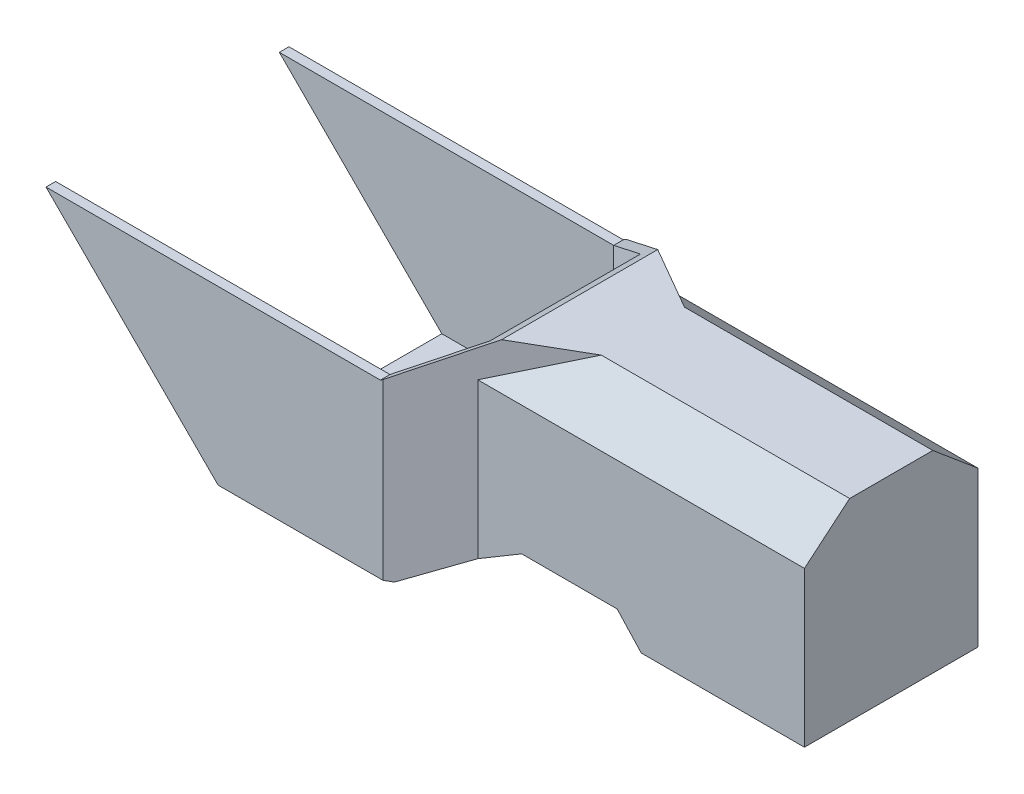
ISO-10303-21;
HEADER;
FILE_DESCRIPTION(('STEP AP214'),'2;1');
FILE_NAME('part.step','',(''),(''),'','','');
FILE_SCHEMA(('AUTOMOTIVE_DESIGN { 1 0 10303 214 1 1 1 1 }'));
ENDSEC;
DATA;
#1=APPLICATION_CONTEXT('core data for automotive mechanical design processes');
#2=APPLICATION_PROTOCOL_DEFINITION('international standard','automotive_design',2000,#1);
#3=PRODUCT_CONTEXT('',#1,'mechanical');
#4=PRODUCT('Part','Part','',(#3));
#5=PRODUCT_RELATED_PRODUCT_CATEGORY('part','',(#4));
#6=PRODUCT_DEFINITION_FORMATION('','',#4);
#7=PRODUCT_DEFINITION_CONTEXT('part definition',#1,'design');
#8=PRODUCT_DEFINITION('design','',#6,#7);
#9=PRODUCT_DEFINITION_SHAPE('','',#8);
#10=(LENGTH_UNIT() NAMED_UNIT(*) SI_UNIT(.MILLI.,.METRE.));
#11=(NAMED_UNIT(*) PLANE_ANGLE_UNIT() SI_UNIT($,.RADIAN.));
#12=(NAMED_UNIT(*) SI_UNIT($,.STERADIAN.) SOLID_ANGLE_UNIT());
#13=UNCERTAINTY_MEASURE_WITH_UNIT(LENGTH_MEASURE(1.E-05),#10,'distance_accuracy_value','');
#14=(GEOMETRIC_REPRESENTATION_CONTEXT(3) GLOBAL_UNCERTAINTY_ASSIGNED_CONTEXT((#13)) GLOBAL_UNIT_ASSIGNED_CONTEXT((#10,
#11,#12)) REPRESENTATION_CONTEXT('',''));
#15=CARTESIAN_POINT('',(0.,0.,0.));
#16=DIRECTION('',(0.,0.,1.));
#17=DIRECTION('',(1.,0.,0.));
#18=AXIS2_PLACEMENT_3D('',#15,#16,#17);
#19=CARTESIAN_POINT('',(823.113265829973,656.076560964654,-1.2E-05));
#20=DIRECTION('',(0.556837554487438,-0.830621416719103,0.));
#21=DIRECTION('',(0.830621416719103,0.556837554487439,0.));
#22=AXIS2_PLACEMENT_3D('',#19,#20,#21);
#23=PLANE('',#22);
#24=DIRECTION('',(-0.748953016614914,-0.502088144855617,-0.432408225753008));
#25=VECTOR('',#24,1.);
#26=CARTESIAN_POINT('',(572.76593130731,488.247036319503,-314.154092808825));
#27=LINE('',#26,#25);
#28=CARTESIAN_POINT('',(779.145427209484,626.601106514855,-195.000835294484));
#29=VERTEX_POINT('',#28);
#30=CARTESIAN_POINT('',(614.602047262927,516.293412236459,-290.));
#31=VERTEX_POINT('',#30);
#32=EDGE_CURVE('E720',#29,#31,#27,.T.);
#33=ORIENTED_EDGE('',*,*,#32,.F.);
#34=DIRECTION('',(0.,0.,-1.));
#35=VECTOR('',#34,1.);
#36=CARTESIAN_POINT('',(779.145427209484,626.601106514855,0.));
#37=LINE('',#36,#35);
#38=CARTESIAN_POINT('',(779.145427209484,626.601106514855,195.000835294484));
#39=VERTEX_POINT('',#38);
#40=EDGE_CURVE('E758',#39,#29,#37,.T.);
#41=ORIENTED_EDGE('',*,*,#40,.F.);
#42=DIRECTION('',(-0.748953016614914,-0.502088144855617,0.432408225753008));
#43=VECTOR('',#42,1.);
#44=CARTESIAN_POINT('',(572.76593130731,488.247036319503,314.154092808825));
#45=LINE('',#44,#43);
#46=CARTESIAN_POINT('',(614.602047262927,516.293412236459,290.));
#47=VERTEX_POINT('',#46);
#48=EDGE_CURVE('E288',#39,#47,#45,.T.);
#49=ORIENTED_EDGE('',*,*,#48,.T.);
#50=DIRECTION('',(0.,0.,1.));
#51=VECTOR('',#50,1.);
#52=CARTESIAN_POINT('',(614.602047262927,516.293412236459,-1.2E-05));
#53=LINE('',#52,#51);
#54=CARTESIAN_POINT('',(614.602047262927,516.293412236459,315.));
#55=VERTEX_POINT('',#54);
#56=EDGE_CURVE('E282',#47,#55,#53,.T.);
#57=ORIENTED_EDGE('',*,*,#56,.T.);
#58=DIRECTION('',(0.830621416719103,0.556837554487439,0.));
#59=VECTOR('',#58,1.);
#60=CARTESIAN_POINT('',(823.113265829973,656.076560964654,315.));
#61=LINE('',#60,#59);
#62=CARTESIAN_POINT('',(621.300777073706,520.784151640628,315.));
#63=VERTEX_POINT('',#62);
#64=EDGE_CURVE('E41',#55,#63,#61,.T.);
#65=ORIENTED_EDGE('',*,*,#64,.T.);
#66=DIRECTION('',(-0.748953016614914,-0.502088144855617,0.432408225753008));
#67=VECTOR('',#66,1.);
#68=CARTESIAN_POINT('',(582.114774992253,494.514376831107,337.624048850192));
#69=LINE('',#68,#67);
#70=CARTESIAN_POINT('',(816.437336224299,651.601106514855,202.337855045667));
#71=VERTEX_POINT('',#70);
#72=EDGE_CURVE('E165',#71,#63,#69,.T.);
#73=ORIENTED_EDGE('',*,*,#72,.F.);
#74=DIRECTION('',(0.,0.,-1.));
#75=VECTOR('',#74,1.);
#76=CARTESIAN_POINT('',(816.437336224299,651.601106514855,0.));
#77=LINE('',#76,#75);
#78=CARTESIAN_POINT('',(816.437336224299,651.601106514855,-202.337855045667));
#79=VERTEX_POINT('',#78);
#80=EDGE_CURVE('E168',#71,#79,#77,.T.);
#81=ORIENTED_EDGE('',*,*,#80,.T.);
#82=DIRECTION('',(-0.748953016614914,-0.502088144855617,-0.432408225753008));
#83=VECTOR('',#82,1.);
#84=CARTESIAN_POINT('',(887.392828925045,699.168725453696,-161.371682234408));
#85=LINE('',#84,#83);
#86=CARTESIAN_POINT('',(621.300777073706,520.784151640628,-315.));
#87=VERTEX_POINT('',#86);
#88=EDGE_CURVE('E57',#79,#87,#85,.T.);
#89=ORIENTED_EDGE('',*,*,#88,.T.);
#90=DIRECTION('',(0.830621416719103,0.556837554487439,0.));
#91=VECTOR('',#90,1.);
#92=CARTESIAN_POINT('',(67.4957418236851,149.520618959844,-315.));
#93=LINE('',#92,#91);
#94=CARTESIAN_POINT('',(614.602047262926,516.293412236459,-315.));
#95=VERTEX_POINT('',#94);
#96=EDGE_CURVE('E11',#95,#87,#93,.T.);
#97=ORIENTED_EDGE('',*,*,#96,.F.);
#98=EDGE_CURVE('E185',#95,#31,#53,.T.);
#99=ORIENTED_EDGE('',*,*,#98,.T.);
#100=EDGE_LOOP('',(#33,#41,#49,#57,#65,#73,#81,#89,#97,#99));
#101=FACE_BOUND('',#100,.T.);
#102=ADVANCED_FACE('F33',(#101),#23,.F.);
#103=CARTESIAN_POINT('',(614.602047262927,516.293412236459,-1.2E-05));
#104=DIRECTION('',(0.,-1.,0.));
#105=DIRECTION('',(1.,0.,0.));
#106=AXIS2_PLACEMENT_3D('',#103,#104,#105);
#107=PLANE('',#106);
#108=DIRECTION('',(1.,0.,0.));
#109=VECTOR('',#108,1.);
#110=CARTESIAN_POINT('',(614.602047262927,516.293412236459,290.));
#111=LINE('',#110,#109);
#112=CARTESIAN_POINT('',(-252.332674150865,516.293412236459,290.));
#113=VERTEX_POINT('',#112);
#114=EDGE_CURVE('E756',#113,#47,#111,.T.);
#115=ORIENTED_EDGE('',*,*,#114,.F.);
#116=DIRECTION('',(0.,0.,1.));
#117=VECTOR('',#116,1.);
#118=CARTESIAN_POINT('',(-252.332674150865,516.293412236459,0.));
#119=LINE('',#118,#117);
#120=CARTESIAN_POINT('',(-252.332674150865,516.293412236459,315.));
#121=VERTEX_POINT('',#120);
#122=EDGE_CURVE('E212',#113,#121,#119,.T.);
#123=ORIENTED_EDGE('',*,*,#122,.T.);
#124=DIRECTION('',(1.,0.,0.));
#125=VECTOR('',#124,1.);
#126=CARTESIAN_POINT('',(614.602047262927,516.293412236459,315.));
#127=LINE('',#126,#125);
#128=EDGE_CURVE('E280',#121,#55,#127,.T.);
#129=ORIENTED_EDGE('',*,*,#128,.T.);
#130=ORIENTED_EDGE('',*,*,#56,.F.);
#131=EDGE_LOOP('',(#115,#123,#129,#130));
#132=FACE_BOUND('',#131,.T.);
#133=ADVANCED_FACE('F372',(#132),#107,.F.);
#134=CARTESIAN_POINT('',(-252.332674150865,70.,0.));
#135=DIRECTION('',(0.,1.,0.));
#136=DIRECTION('',(0.,0.,1.));
#137=AXIS2_PLACEMENT_3D('',#134,#135,#136);
#138=PLANE('',#137);
#139=DIRECTION('',(0.,0.,1.));
#140=VECTOR('',#139,1.);
#141=CARTESIAN_POINT('',(193.960738085595,70.,0.));
#142=LINE('',#141,#140);
#143=CARTESIAN_POINT('',(193.960738085595,70.,-315.));
#144=VERTEX_POINT('',#143);
#145=CARTESIAN_POINT('',(193.960738085595,70.,315.));
#146=VERTEX_POINT('',#145);
#147=EDGE_CURVE('E193',#144,#146,#142,.T.);
#148=ORIENTED_EDGE('',*,*,#147,.F.);
#149=DIRECTION('',(1.,0.,0.));
#150=VECTOR('',#149,1.);
#151=CARTESIAN_POINT('',(-252.332674150865,70.,-315.));
#152=LINE('',#151,#150);
#153=CARTESIAN_POINT('',(621.300777073706,70.,-315.));
#154=VERTEX_POINT('',#153);
#155=EDGE_CURVE('E245',#144,#154,#152,.T.);
#156=ORIENTED_EDGE('',*,*,#155,.T.);
#157=DIRECTION('',(-0.866025403784436,0.,-0.500000000000004));
#158=VECTOR('',#157,1.);
#159=CARTESIAN_POINT('',(782.986619944125,70.,-221.650635094611));
#160=LINE('',#159,#158);
#161=CARTESIAN_POINT('',(640.251617075043,70.,-304.058727423859));
#162=VERTEX_POINT('',#161);
#163=EDGE_CURVE('E255',#162,#154,#160,.T.);
#164=ORIENTED_EDGE('',*,*,#163,.F.);
#165=DIRECTION('',(0.,0.,-1.));
#166=VECTOR('',#165,1.);
#167=CARTESIAN_POINT('',(640.251617075042,70.,2.06251711034448E-13));
#168=LINE('',#167,#166);
#169=CARTESIAN_POINT('',(640.251617075043,70.,304.058727423859));
#170=VERTEX_POINT('',#169);
#171=EDGE_CURVE('E269',#170,#162,#168,.T.);
#172=ORIENTED_EDGE('',*,*,#171,.F.);
#173=DIRECTION('',(-0.866025403784436,0.,0.500000000000004));
#174=VECTOR('',#173,1.);
#175=CARTESIAN_POINT('',(102.474689751332,69.9999999999999,614.544381178177));
#176=LINE('',#175,#174);
#177=CARTESIAN_POINT('',(621.300777073706,70.,315.));
#178=VERTEX_POINT('',#177);
#179=EDGE_CURVE('E192',#170,#178,#176,.T.);
#180=ORIENTED_EDGE('',*,*,#179,.T.);
#181=DIRECTION('',(1.,0.,0.));
#182=VECTOR('',#181,1.);
#183=CARTESIAN_POINT('',(-252.332674150865,70.,315.));
#184=LINE('',#183,#182);
#185=EDGE_CURVE('E232',#146,#178,#184,.T.);
#186=ORIENTED_EDGE('',*,*,#185,.F.);
#187=EDGE_LOOP('',(#148,#156,#164,#172,#180,#186));
#188=FACE_BOUND('',#187,.T.);
#189=ADVANCED_FACE('F326',(#188),#138,.F.);
#190=CARTESIAN_POINT('',(-252.332674150865,626.601106514855,315.));
#191=DIRECTION('',(0.,0.,-1.));
#192=DIRECTION('',(0.,1.,0.));
#193=AXIS2_PLACEMENT_3D('',#190,#191,#192);
#194=PLANE('',#193);
#195=DIRECTION('',(0.,1.,0.));
#196=VECTOR('',#195,1.);
#197=CARTESIAN_POINT('',(621.300777073706,626.601106514855,315.));
#198=LINE('',#197,#196);
#199=EDGE_CURVE('E196',#178,#63,#198,.T.);
#200=ORIENTED_EDGE('',*,*,#199,.T.);
#201=ORIENTED_EDGE('',*,*,#64,.F.);
#202=ORIENTED_EDGE('',*,*,#128,.F.);
#203=DIRECTION('',(-0.707106781186548,0.707106781186548,0.));
#204=VECTOR('',#203,1.);
#205=CARTESIAN_POINT('',(-307.486521290062,571.447259375657,315.));
#206=LINE('',#205,#204);
#207=EDGE_CURVE('E184',#146,#121,#206,.T.);
#208=ORIENTED_EDGE('',*,*,#207,.F.);
#209=ORIENTED_EDGE('',*,*,#185,.T.);
#210=EDGE_LOOP('',(#200,#201,#202,#208,#209));
#211=FACE_BOUND('',#210,.T.);
#212=ADVANCED_FACE('F321',(#211),#194,.F.);
#213=CARTESIAN_POINT('',(770.486619944125,151.601106514855,0.));
#214=DIRECTION('',(0.,-1.,0.));
#215=DIRECTION('',(0.,0.,-1.));
#216=AXIS2_PLACEMENT_3D('',#213,#214,#215);
#217=PLANE('',#216);
#218=DIRECTION('',(1.,0.,0.));
#219=VECTOR('',#218,1.);
#220=CARTESIAN_POINT('',(770.486619944125,151.601106514855,225.));
#221=LINE('',#220,#219);
#222=CARTESIAN_POINT('',(1201.00529402661,151.601106514855,225.));
#223=VERTEX_POINT('',#222);
#224=CARTESIAN_POINT('',(1624.16491767807,151.601106514855,225.));
#225=VERTEX_POINT('',#224);
#226=EDGE_CURVE('E209',#223,#225,#221,.T.);
#227=ORIENTED_EDGE('',*,*,#226,.F.);
#228=DIRECTION('',(0.,0.,-1.));
#229=VECTOR('',#228,1.);
#230=CARTESIAN_POINT('',(1201.00529402661,151.601106514855,0.));
#231=LINE('',#230,#229);
#232=CARTESIAN_POINT('',(1201.00529402661,151.601106514855,-225.));
#233=VERTEX_POINT('',#232);
#234=EDGE_CURVE('E222',#223,#233,#231,.T.);
#235=ORIENTED_EDGE('',*,*,#234,.T.);
#236=DIRECTION('',(1.,0.,0.));
#237=VECTOR('',#236,1.);
#238=CARTESIAN_POINT('',(770.486619944125,151.601106514855,-225.));
#239=LINE('',#238,#237);
#240=CARTESIAN_POINT('',(1624.16491767807,151.601106514855,-225.));
#241=VERTEX_POINT('',#240);
#242=EDGE_CURVE('E233',#233,#241,#239,.T.);
#243=ORIENTED_EDGE('',*,*,#242,.T.);
#244=DIRECTION('',(0.,0.,-1.));
#245=VECTOR('',#244,1.);
#246=CARTESIAN_POINT('',(1624.16491767807,151.601106514855,0.));
#247=LINE('',#246,#245);
#248=EDGE_CURVE('E210',#225,#241,#247,.T.);
#249=ORIENTED_EDGE('',*,*,#248,.F.);
#250=EDGE_LOOP('',(#227,#235,#243,#249));
#251=FACE_BOUND('',#250,.T.);
#252=ADVANCED_FACE('F358',(#251),#217,.T.);
#253=CARTESIAN_POINT('',(770.486619944125,176.601106514855,225.));
#254=DIRECTION('',(0.,0.,1.));
#255=DIRECTION('',(1.,0.,0.));
#256=AXIS2_PLACEMENT_3D('',#253,#254,#255);
#257=PLANE('',#256);
#258=DIRECTION('',(0.,-1.,0.));
#259=VECTOR('',#258,1.);
#260=CARTESIAN_POINT('',(1624.16491767807,0.,225.));
#261=LINE('',#260,#259);
#262=CARTESIAN_POINT('',(1624.16491767807,553.258797968729,225.));
#263=VERTEX_POINT('',#262);
#264=EDGE_CURVE('E214',#263,#225,#261,.T.);
#265=ORIENTED_EDGE('',*,*,#264,.F.);
#266=DIRECTION('',(1.,0.,0.));
#267=VECTOR('',#266,1.);
#268=CARTESIAN_POINT('',(770.486619944125,553.258797968729,225.));
#269=LINE('',#268,#267);
#270=CARTESIAN_POINT('',(777.185349754903,553.258797968729,225.));
#271=VERTEX_POINT('',#270);
#272=EDGE_CURVE('E213',#263,#271,#269,.F.);
#273=ORIENTED_EDGE('',*,*,#272,.T.);
#274=DIRECTION('',(0.,-1.,0.));
#275=VECTOR('',#274,1.);
#276=CARTESIAN_POINT('',(777.185349754903,176.601106514855,225.));
#277=LINE('',#276,#275);
#278=CARTESIAN_POINT('',(777.185349754903,151.49532772926,225.));
#279=VERTEX_POINT('',#278);
#280=EDGE_CURVE('E207',#271,#279,#277,.T.);
#281=ORIENTED_EDGE('',*,*,#280,.T.);
#282=DIRECTION('',(0.859328315202025,0.511424331345361,0.));
#283=VECTOR('',#282,1.);
#284=CARTESIAN_POINT('',(783.272228227759,155.117898634804,225.));
#285=LINE('',#284,#283);
#286=CARTESIAN_POINT('',(891.064747675951,219.27,225.));
#287=VERTEX_POINT('',#286);
#288=EDGE_CURVE('E219',#279,#287,#285,.T.);
#289=ORIENTED_EDGE('',*,*,#288,.T.);
#290=DIRECTION('',(1.,0.,0.));
#291=VECTOR('',#290,1.);
#292=CARTESIAN_POINT('',(770.486619944125,219.27,225.));
#293=LINE('',#292,#291);
#294=CARTESIAN_POINT('',(1138.63964051732,219.27,225.));
#295=VERTEX_POINT('',#294);
#296=EDGE_CURVE('E206',#287,#295,#293,.T.);
#297=ORIENTED_EDGE('',*,*,#296,.T.);
#298=DIRECTION('',(0.677705249893558,-0.735333661861546,0.));
#299=VECTOR('',#298,1.);
#300=CARTESIAN_POINT('',(990.816293566874,379.663449864487,225.));
#301=LINE('',#300,#299);
#302=EDGE_CURVE('E226',#295,#223,#301,.T.);
#303=ORIENTED_EDGE('',*,*,#302,.T.);
#304=ORIENTED_EDGE('',*,*,#226,.T.);
#305=EDGE_LOOP('',(#265,#273,#281,#289,#297,#303,#304));
#306=FACE_BOUND('',#305,.T.);
#307=ADVANCED_FACE('F345',(#306),#257,.T.);
#308=CARTESIAN_POINT('',(770.486619944125,651.601106514855,0.));
#309=DIRECTION('',(0.,1.,0.));
#310=DIRECTION('',(0.,0.,1.));
#311=AXIS2_PLACEMENT_3D('',#308,#309,#310);
#312=PLANE('',#311);
#313=ORIENTED_EDGE('',*,*,#80,.F.);
#314=DIRECTION('',(-0.866025403784436,0.,0.500000000000004));
#315=VECTOR('',#314,1.);
#316=CARTESIAN_POINT('',(869.58916032257,651.601106514855,171.65063509461));
#317=LINE('',#316,#315);
#318=CARTESIAN_POINT('',(980.18135714978,651.601106514855,107.800200486147));
#319=VERTEX_POINT('',#318);
#320=EDGE_CURVE('E179',#319,#71,#317,.T.);
#321=ORIENTED_EDGE('',*,*,#320,.F.);
#322=DIRECTION('',(-1.,0.,0.));
#323=VECTOR('',#322,1.);
#324=CARTESIAN_POINT('',(770.486619944125,651.601106514855,107.800200486147));
#325=LINE('',#324,#323);
#326=CARTESIAN_POINT('',(1624.16491767807,651.601106514855,107.800200486147));
#327=VERTEX_POINT('',#326);
#328=EDGE_CURVE('E205',#319,#327,#325,.F.);
#329=ORIENTED_EDGE('',*,*,#328,.T.);
#330=DIRECTION('',(0.,0.,1.));
#331=VECTOR('',#330,1.);
#332=CARTESIAN_POINT('',(1624.16491767807,651.601106514855,0.));
#333=LINE('',#332,#331);
#334=CARTESIAN_POINT('',(1624.16491767807,651.601106514855,-107.800200486147));
#335=VERTEX_POINT('',#334);
#336=EDGE_CURVE('E216',#335,#327,#333,.T.);
#337=ORIENTED_EDGE('',*,*,#336,.F.);
#338=DIRECTION('',(-1.,0.,0.));
#339=VECTOR('',#338,1.);
#340=CARTESIAN_POINT('',(770.486619944125,651.601106514855,-107.800200486147));
#341=LINE('',#340,#339);
#342=CARTESIAN_POINT('',(980.18135714978,651.601106514855,-107.800200486147));
#343=VERTEX_POINT('',#342);
#344=EDGE_CURVE('E249',#343,#335,#341,.F.);
#345=ORIENTED_EDGE('',*,*,#344,.F.);
#346=DIRECTION('',(-0.866025403784436,0.,-0.500000000000004));
#347=VECTOR('',#346,1.);
#348=CARTESIAN_POINT('',(782.986619944125,651.601106514855,-221.650635094611));
#349=LINE('',#348,#347);
#350=EDGE_CURVE('E183',#343,#79,#349,.T.);
#351=ORIENTED_EDGE('',*,*,#350,.T.);
#352=EDGE_LOOP('',(#313,#321,#329,#337,#345,#351));
#353=FACE_BOUND('',#352,.T.);
#354=ADVANCED_FACE('F177',(#353),#312,.T.);
#355=CARTESIAN_POINT('',(1624.16491767807,0.,0.));
#356=DIRECTION('',(1.,0.,0.));
#357=DIRECTION('',(0.,0.,-1.));
#358=AXIS2_PLACEMENT_3D('',#355,#356,#357);
#359=PLANE('',#358);
#360=ORIENTED_EDGE('',*,*,#336,.T.);
#361=DIRECTION('',(0.,0.642787609686541,-0.766044443118976));
#362=VECTOR('',#361,1.);
#363=CARTESIAN_POINT('',(1624.16491767807,435.45646222097,365.391356843381));
#364=LINE('',#363,#362);
#365=EDGE_CURVE('E218',#327,#263,#364,.F.);
#366=ORIENTED_EDGE('',*,*,#365,.T.);
#367=ORIENTED_EDGE('',*,*,#264,.T.);
#368=ORIENTED_EDGE('',*,*,#248,.T.);
#369=DIRECTION('',(0.,-1.,0.));
#370=VECTOR('',#369,1.);
#371=CARTESIAN_POINT('',(1624.16491767807,176.601106514855,-225.));
#372=LINE('',#371,#370);
#373=CARTESIAN_POINT('',(1624.16491767807,553.258797968729,-225.));
#374=VERTEX_POINT('',#373);
#375=EDGE_CURVE('E242',#374,#241,#372,.T.);
#376=ORIENTED_EDGE('',*,*,#375,.F.);
#377=DIRECTION('',(0.,0.642787609686541,0.766044443118976));
#378=VECTOR('',#377,1.);
#379=CARTESIAN_POINT('',(1624.16491767807,645.752217592829,-114.770634871656));
#380=LINE('',#379,#378);
#381=EDGE_CURVE('E246',#335,#374,#380,.F.);
#382=ORIENTED_EDGE('',*,*,#381,.F.);
#383=EDGE_LOOP('',(#360,#366,#367,#368,#376,#382));
#384=FACE_BOUND('',#383,.T.);
#385=ADVANCED_FACE('F351',(#384),#359,.T.);
#386=CARTESIAN_POINT('',(896.973889776019,222.786792119949,290.));
#387=DIRECTION('',(0.511424331345361,-0.859328315202025,0.));
#388=DIRECTION('',(0.859328315202025,0.511424331345361,0.));
#389=AXIS2_PLACEMENT_3D('',#386,#387,#388);
#390=PLANE('',#389);
#391=DIRECTION('',(0.769793505569307,0.45813820154085,-0.44444048766087));
#392=VECTOR('',#391,1.);
#393=CARTESIAN_POINT('',(851.074096190121,195.469792518884,182.340312355542));
#394=LINE('',#393,#392);
#395=EDGE_CURVE('E202',#170,#279,#394,.T.);
#396=ORIENTED_EDGE('',*,*,#395,.F.);
#397=ORIENTED_EDGE('',*,*,#171,.T.);
#398=DIRECTION('',(0.769793505569307,0.45813820154085,0.44444048766087));
#399=VECTOR('',#398,1.);
#400=CARTESIAN_POINT('',(761.844678184334,142.365414794269,-233.856940860818));
#401=LINE('',#400,#399);
#402=CARTESIAN_POINT('',(777.185349754903,151.49532772926,-225.));
#403=VERTEX_POINT('',#402);
#404=EDGE_CURVE('E253',#162,#403,#401,.T.);
#405=ORIENTED_EDGE('',*,*,#404,.T.);
#406=DIRECTION('',(0.859328315202025,0.511424331345361,0.));
#407=VECTOR('',#406,1.);
#408=CARTESIAN_POINT('',(896.973889776019,222.786792119949,-225.));
#409=LINE('',#408,#407);
#410=CARTESIAN_POINT('',(891.064747675951,219.27,-225.));
#411=VERTEX_POINT('',#410);
#412=EDGE_CURVE('E265',#403,#411,#409,.T.);
#413=ORIENTED_EDGE('',*,*,#412,.T.);
#414=DIRECTION('',(0.,0.,-1.));
#415=VECTOR('',#414,1.);
#416=CARTESIAN_POINT('',(891.064747675951,219.27,290.));
#417=LINE('',#416,#415);
#418=EDGE_CURVE('E223',#287,#411,#417,.T.);
#419=ORIENTED_EDGE('',*,*,#418,.F.);
#420=ORIENTED_EDGE('',*,*,#288,.F.);
#421=EDGE_LOOP('',(#396,#397,#405,#413,#419,#420));
#422=FACE_BOUND('',#421,.T.);
#423=ADVANCED_FACE('F330',(#422),#390,.T.);
#424=CARTESIAN_POINT('',(884.188281492385,219.27,290.));
#425=DIRECTION('',(0.,-1.,0.));
#426=DIRECTION('',(0.,0.,-1.));
#427=AXIS2_PLACEMENT_3D('',#424,#425,#426);
#428=PLANE('',#427);
#429=ORIENTED_EDGE('',*,*,#418,.T.);
#430=DIRECTION('',(1.,0.,0.));
#431=VECTOR('',#430,1.);
#432=CARTESIAN_POINT('',(884.188281492385,219.27,-225.));
#433=LINE('',#432,#431);
#434=CARTESIAN_POINT('',(1138.63964051732,219.27,-225.));
#435=VERTEX_POINT('',#434);
#436=EDGE_CURVE('E262',#411,#435,#433,.T.);
#437=ORIENTED_EDGE('',*,*,#436,.T.);
#438=DIRECTION('',(0.,0.,-1.));
#439=VECTOR('',#438,1.);
#440=CARTESIAN_POINT('',(1138.63964051732,219.27,290.));
#441=LINE('',#440,#439);
#442=EDGE_CURVE('E272',#295,#435,#441,.T.);
#443=ORIENTED_EDGE('',*,*,#442,.F.);
#444=ORIENTED_EDGE('',*,*,#296,.F.);
#445=EDGE_LOOP('',(#429,#437,#443,#444));
#446=FACE_BOUND('',#445,.T.);
#447=ADVANCED_FACE('F362',(#446),#428,.T.);
#448=CARTESIAN_POINT('',(1131.21373118225,227.327368752661,290.));
#449=DIRECTION('',(-0.735333661861546,-0.677705249893558,0.));
#450=DIRECTION('',(0.677705249893558,-0.735333661861546,0.));
#451=AXIS2_PLACEMENT_3D('',#448,#449,#450);
#452=PLANE('',#451);
#453=ORIENTED_EDGE('',*,*,#302,.F.);
#454=ORIENTED_EDGE('',*,*,#442,.T.);
#455=DIRECTION('',(0.677705249893558,-0.735333661861546,0.));
#456=VECTOR('',#455,1.);
#457=CARTESIAN_POINT('',(1131.21373118225,227.327368752661,-225.));
#458=LINE('',#457,#456);
#459=EDGE_CURVE('E236',#435,#233,#458,.T.);
#460=ORIENTED_EDGE('',*,*,#459,.T.);
#461=ORIENTED_EDGE('',*,*,#234,.F.);
#462=EDGE_LOOP('',(#453,#454,#460,#461));
#463=FACE_BOUND('',#462,.T.);
#464=ADVANCED_FACE('F360',(#463),#452,.T.);
#465=CARTESIAN_POINT('',(782.986619944125,95.,221.650635094611));
#466=DIRECTION('',(-0.500000000000004,0.,-0.866025403784436));
#467=DIRECTION('',(-0.866025403784436,0.,0.500000000000004));
#468=AXIS2_PLACEMENT_3D('',#465,#466,#467);
#469=PLANE('',#468);
#470=ORIENTED_EDGE('',*,*,#320,.T.);
#471=ORIENTED_EDGE('',*,*,#72,.T.);
#472=ORIENTED_EDGE('',*,*,#199,.F.);
#473=ORIENTED_EDGE('',*,*,#179,.F.);
#474=ORIENTED_EDGE('',*,*,#395,.T.);
#475=ORIENTED_EDGE('',*,*,#280,.F.);
#476=DIRECTION('',(-0.798588220280846,-0.386879575455839,0.461065123950816));
#477=VECTOR('',#476,1.);
#478=CARTESIAN_POINT('',(640.535830582361,487.058337429598,303.894636678901));
#479=LINE('',#478,#477);
#480=EDGE_CURVE('E190',#271,#319,#479,.F.);
#481=ORIENTED_EDGE('',*,*,#480,.T.);
#482=EDGE_LOOP('',(#470,#471,#472,#473,#474,#475,#481));
#483=FACE_BOUND('',#482,.T.);
#484=ADVANCED_FACE('F187',(#483),#469,.F.);
#485=CARTESIAN_POINT('',(770.486619944125,645.752217592829,114.770634871656));
#486=DIRECTION('',(0.,-0.766044443118976,-0.642787609686541));
#487=DIRECTION('',(1.,0.,0.));
#488=AXIS2_PLACEMENT_3D('',#485,#486,#487);
#489=PLANE('',#488);
#490=ORIENTED_EDGE('',*,*,#480,.F.);
#491=ORIENTED_EDGE('',*,*,#272,.F.);
#492=ORIENTED_EDGE('',*,*,#365,.F.);
#493=ORIENTED_EDGE('',*,*,#328,.F.);
#494=EDGE_LOOP('',(#490,#491,#492,#493));
#495=FACE_BOUND('',#494,.T.);
#496=ADVANCED_FACE('F348',(#495),#489,.F.);
#497=CARTESIAN_POINT('',(-284.759468108751,548.720206194346,290.));
#498=DIRECTION('',(-0.707106781186548,-0.707106781186548,0.));
#499=DIRECTION('',(0.707106781186548,-0.707106781186548,0.));
#500=AXIS2_PLACEMENT_3D('',#497,#498,#499);
#501=PLANE('',#500);
#502=DIRECTION('',(-0.707106781186548,0.707106781186548,0.));
#503=VECTOR('',#502,1.);
#504=CARTESIAN_POINT('',(-284.759468108751,548.720206194346,290.));
#505=LINE('',#504,#503);
#506=CARTESIAN_POINT('',(168.960738085595,94.9999999999999,290.));
#507=VERTEX_POINT('',#506);
#508=EDGE_CURVE('E48',#507,#113,#505,.T.);
#509=ORIENTED_EDGE('',*,*,#508,.F.);
#510=DIRECTION('',(0.,0.,1.));
#511=VECTOR('',#510,1.);
#512=CARTESIAN_POINT('',(168.960738085595,95.,0.));
#513=LINE('',#512,#511);
#514=CARTESIAN_POINT('',(168.960738085595,94.9999999999999,-290.));
#515=VERTEX_POINT('',#514);
#516=EDGE_CURVE('E762',#515,#507,#513,.T.);
#517=ORIENTED_EDGE('',*,*,#516,.F.);
#518=DIRECTION('',(-0.707106781186548,0.707106781186548,0.));
#519=VECTOR('',#518,1.);
#520=CARTESIAN_POINT('',(-284.759468108751,548.720206194346,-290.));
#521=LINE('',#520,#519);
#522=CARTESIAN_POINT('',(-252.332674150865,516.293412236459,-290.));
#523=VERTEX_POINT('',#522);
#524=EDGE_CURVE('E304',#515,#523,#521,.T.);
#525=ORIENTED_EDGE('',*,*,#524,.T.);
#526=CARTESIAN_POINT('',(-252.332674150865,516.293412236459,-315.));
#527=VERTEX_POINT('',#526);
#528=EDGE_CURVE('E173',#527,#523,#119,.T.);
#529=ORIENTED_EDGE('',*,*,#528,.F.);
#530=DIRECTION('',(-0.707106781186548,0.707106781186548,0.));
#531=VECTOR('',#530,1.);
#532=CARTESIAN_POINT('',(-284.759468108751,548.720206194346,-315.));
#533=LINE('',#532,#531);
#534=EDGE_CURVE('E256',#144,#527,#533,.T.);
#535=ORIENTED_EDGE('',*,*,#534,.F.);
#536=ORIENTED_EDGE('',*,*,#147,.T.);
#537=ORIENTED_EDGE('',*,*,#207,.T.);
#538=ORIENTED_EDGE('',*,*,#122,.F.);
#539=EDGE_LOOP('',(#509,#517,#525,#529,#535,#536,#537,#538));
#540=FACE_BOUND('',#539,.T.);
#541=ADVANCED_FACE('F297',(#540),#501,.T.);
#542=ORIENTED_EDGE('',*,*,#528,.T.);
#543=DIRECTION('',(1.,0.,0.));
#544=VECTOR('',#543,1.);
#545=CARTESIAN_POINT('',(614.602047262927,516.293412236459,-290.));
#546=LINE('',#545,#544);
#547=EDGE_CURVE('E311',#523,#31,#546,.T.);
#548=ORIENTED_EDGE('',*,*,#547,.T.);
#549=ORIENTED_EDGE('',*,*,#98,.F.);
#550=DIRECTION('',(1.,0.,0.));
#551=VECTOR('',#550,1.);
#552=CARTESIAN_POINT('',(-252.332674150865,516.293412236459,-315.));
#553=LINE('',#552,#551);
#554=EDGE_CURVE('E285',#527,#95,#553,.T.);
#555=ORIENTED_EDGE('',*,*,#554,.F.);
#556=EDGE_LOOP('',(#542,#548,#549,#555));
#557=FACE_BOUND('',#556,.T.);
#558=ADVANCED_FACE('F308',(#557),#107,.F.);
#559=CARTESIAN_POINT('',(-252.332674150865,626.601106514855,-315.));
#560=DIRECTION('',(0.,0.,1.));
#561=DIRECTION('',(0.,1.,0.));
#562=AXIS2_PLACEMENT_3D('',#559,#560,#561);
#563=PLANE('',#562);
#564=DIRECTION('',(0.,1.,0.));
#565=VECTOR('',#564,1.);
#566=CARTESIAN_POINT('',(621.300777073706,95.,-315.));
#567=LINE('',#566,#565);
#568=EDGE_CURVE('E263',#154,#87,#567,.T.);
#569=ORIENTED_EDGE('',*,*,#568,.F.);
#570=ORIENTED_EDGE('',*,*,#155,.F.);
#571=ORIENTED_EDGE('',*,*,#534,.T.);
#572=ORIENTED_EDGE('',*,*,#554,.T.);
#573=ORIENTED_EDGE('',*,*,#96,.T.);
#574=EDGE_LOOP('',(#569,#570,#571,#572,#573));
#575=FACE_BOUND('',#574,.T.);
#576=ADVANCED_FACE('F293',(#575),#563,.F.);
#577=CARTESIAN_POINT('',(770.486619944125,176.601106514855,-225.));
#578=DIRECTION('',(0.,0.,-1.));
#579=DIRECTION('',(1.,0.,0.));
#580=AXIS2_PLACEMENT_3D('',#577,#578,#579);
#581=PLANE('',#580);
#582=ORIENTED_EDGE('',*,*,#375,.T.);
#583=ORIENTED_EDGE('',*,*,#242,.F.);
#584=ORIENTED_EDGE('',*,*,#459,.F.);
#585=ORIENTED_EDGE('',*,*,#436,.F.);
#586=ORIENTED_EDGE('',*,*,#412,.F.);
#587=DIRECTION('',(0.,-1.,0.));
#588=VECTOR('',#587,1.);
#589=CARTESIAN_POINT('',(777.185349754903,95.,-225.));
#590=LINE('',#589,#588);
#591=CARTESIAN_POINT('',(777.185349754903,553.258797968729,-225.));
#592=VERTEX_POINT('',#591);
#593=EDGE_CURVE('E237',#592,#403,#590,.T.);
#594=ORIENTED_EDGE('',*,*,#593,.F.);
#595=DIRECTION('',(1.,0.,0.));
#596=VECTOR('',#595,1.);
#597=CARTESIAN_POINT('',(770.486619944125,553.258797968729,-225.));
#598=LINE('',#597,#596);
#599=EDGE_CURVE('E248',#374,#592,#598,.F.);
#600=ORIENTED_EDGE('',*,*,#599,.F.);
#601=EDGE_LOOP('',(#582,#583,#584,#585,#586,#594,#600));
#602=FACE_BOUND('',#601,.T.);
#603=ADVANCED_FACE('F339',(#602),#581,.T.);
#604=CARTESIAN_POINT('',(782.986619944125,95.,-221.650635094611));
#605=DIRECTION('',(-0.500000000000004,0.,0.866025403784436));
#606=DIRECTION('',(-0.866025403784436,0.,-0.500000000000004));
#607=AXIS2_PLACEMENT_3D('',#604,#605,#606);
#608=PLANE('',#607);
#609=ORIENTED_EDGE('',*,*,#350,.F.);
#610=DIRECTION('',(-0.798588220280846,-0.386879575455839,-0.461065123950816));
#611=VECTOR('',#610,1.);
#612=CARTESIAN_POINT('',(842.076395757982,584.695550591661,-187.535137122126));
#613=LINE('',#612,#611);
#614=EDGE_CURVE('E257',#592,#343,#613,.F.);
#615=ORIENTED_EDGE('',*,*,#614,.F.);
#616=ORIENTED_EDGE('',*,*,#593,.T.);
#617=ORIENTED_EDGE('',*,*,#404,.F.);
#618=ORIENTED_EDGE('',*,*,#163,.T.);
#619=ORIENTED_EDGE('',*,*,#568,.T.);
#620=ORIENTED_EDGE('',*,*,#88,.F.);
#621=EDGE_LOOP('',(#609,#615,#616,#617,#618,#619,#620));
#622=FACE_BOUND('',#621,.T.);
#623=ADVANCED_FACE('F333',(#622),#608,.F.);
#624=CARTESIAN_POINT('',(770.486619944125,645.752217592829,-114.770634871656));
#625=DIRECTION('',(0.,-0.766044443118976,0.642787609686541));
#626=DIRECTION('',(1.,0.,0.));
#627=AXIS2_PLACEMENT_3D('',#624,#625,#626);
#628=PLANE('',#627);
#629=ORIENTED_EDGE('',*,*,#614,.T.);
#630=ORIENTED_EDGE('',*,*,#344,.T.);
#631=ORIENTED_EDGE('',*,*,#381,.T.);
#632=ORIENTED_EDGE('',*,*,#599,.T.);
#633=EDGE_LOOP('',(#629,#630,#631,#632));
#634=FACE_BOUND('',#633,.T.);
#635=ADVANCED_FACE('F35',(#634),#628,.F.);
#636=CARTESIAN_POINT('',(-252.332674150865,95.,0.));
#637=DIRECTION('',(0.,1.,0.));
#638=DIRECTION('',(0.,0.,1.));
#639=AXIS2_PLACEMENT_3D('',#636,#637,#638);
#640=PLANE('',#639);
#641=ORIENTED_EDGE('',*,*,#516,.T.);
#642=DIRECTION('',(1.,0.,0.));
#643=VECTOR('',#642,1.);
#644=CARTESIAN_POINT('',(-252.332674150865,94.9999999999999,290.));
#645=LINE('',#644,#643);
#646=CARTESIAN_POINT('',(614.602047262928,95.,290.));
#647=VERTEX_POINT('',#646);
#648=EDGE_CURVE('E789',#507,#647,#645,.T.);
#649=ORIENTED_EDGE('',*,*,#648,.T.);
#650=DIRECTION('',(-0.866025403784436,0.,0.500000000000004));
#651=VECTOR('',#650,1.);
#652=CARTESIAN_POINT('',(770.486619944125,95.,200.));
#653=LINE('',#652,#651);
#654=CARTESIAN_POINT('',(633.375150891476,94.9999999999999,279.161343566533));
#655=VERTEX_POINT('',#654);
#656=EDGE_CURVE('E766',#655,#647,#653,.T.);
#657=ORIENTED_EDGE('',*,*,#656,.F.);
#658=DIRECTION('',(0.,0.,-1.));
#659=VECTOR('',#658,1.);
#660=CARTESIAN_POINT('',(633.375150891476,94.9999999999999,290.));
#661=LINE('',#660,#659);
#662=CARTESIAN_POINT('',(633.375150891476,94.9999999999999,-279.161343566533));
#663=VERTEX_POINT('',#662);
#664=EDGE_CURVE('E777',#655,#663,#661,.T.);
#665=ORIENTED_EDGE('',*,*,#664,.T.);
#666=DIRECTION('',(-0.866025403784436,0.,-0.500000000000004));
#667=VECTOR('',#666,1.);
#668=CARTESIAN_POINT('',(770.486619944125,95.,-200.));
#669=LINE('',#668,#667);
#670=CARTESIAN_POINT('',(614.602047262928,95.,-290.));
#671=VERTEX_POINT('',#670);
#672=EDGE_CURVE('E869',#663,#671,#669,.T.);
#673=ORIENTED_EDGE('',*,*,#672,.T.);
#674=DIRECTION('',(1.,0.,0.));
#675=VECTOR('',#674,1.);
#676=CARTESIAN_POINT('',(-252.332674150865,94.9999999999999,-290.));
#677=LINE('',#676,#675);
#678=EDGE_CURVE('E740',#515,#671,#677,.T.);
#679=ORIENTED_EDGE('',*,*,#678,.F.);
#680=EDGE_LOOP('',(#641,#649,#657,#665,#673,#679));
#681=FACE_BOUND('',#680,.T.);
#682=ADVANCED_FACE('F481',(#681),#640,.T.);
#683=CARTESIAN_POINT('',(-252.332674150865,626.601106514855,290.));
#684=DIRECTION('',(0.,0.,-1.));
#685=DIRECTION('',(0.,1.,0.));
#686=AXIS2_PLACEMENT_3D('',#683,#684,#685);
#687=PLANE('',#686);
#688=DIRECTION('',(0.,1.,0.));
#689=VECTOR('',#688,1.);
#690=CARTESIAN_POINT('',(614.602047262928,95.,290.));
#691=LINE('',#690,#689);
#692=EDGE_CURVE('E769',#647,#47,#691,.T.);
#693=ORIENTED_EDGE('',*,*,#692,.F.);
#694=ORIENTED_EDGE('',*,*,#648,.F.);
#695=ORIENTED_EDGE('',*,*,#508,.T.);
#696=ORIENTED_EDGE('',*,*,#114,.T.);
#697=EDGE_LOOP('',(#693,#694,#695,#696));
#698=FACE_BOUND('',#697,.T.);
#699=ADVANCED_FACE('F489',(#698),#687,.T.);
#700=CARTESIAN_POINT('',(770.486619944125,176.601106514855,0.));
#701=DIRECTION('',(0.,-1.,0.));
#702=DIRECTION('',(0.,0.,-1.));
#703=AXIS2_PLACEMENT_3D('',#700,#701,#702);
#704=PLANE('',#703);
#705=DIRECTION('',(1.,0.,0.));
#706=VECTOR('',#705,1.);
#707=CARTESIAN_POINT('',(770.486619944125,176.601106514855,200.));
#708=LINE('',#707,#706);
#709=CARTESIAN_POINT('',(1211.96272623808,176.601106514855,200.));
#710=VERTEX_POINT('',#709);
#711=CARTESIAN_POINT('',(1599.16491767807,176.601106514855,200.));
#712=VERTEX_POINT('',#711);
#713=EDGE_CURVE('E796',#710,#712,#708,.T.);
#714=ORIENTED_EDGE('',*,*,#713,.T.);
#715=DIRECTION('',(0.,0.,-1.));
#716=VECTOR('',#715,1.);
#717=CARTESIAN_POINT('',(1599.16491767807,176.601106514855,0.));
#718=LINE('',#717,#716);
#719=CARTESIAN_POINT('',(1599.16491767807,176.601106514855,-200.));
#720=VERTEX_POINT('',#719);
#721=EDGE_CURVE('E797',#712,#720,#718,.T.);
#722=ORIENTED_EDGE('',*,*,#721,.T.);
#723=DIRECTION('',(1.,0.,0.));
#724=VECTOR('',#723,1.);
#725=CARTESIAN_POINT('',(770.486619944125,176.601106514855,-200.));
#726=LINE('',#725,#724);
#727=CARTESIAN_POINT('',(1211.96272623808,176.601106514855,-200.));
#728=VERTEX_POINT('',#727);
#729=EDGE_CURVE('E736',#728,#720,#726,.T.);
#730=ORIENTED_EDGE('',*,*,#729,.F.);
#731=DIRECTION('',(0.,0.,-1.));
#732=VECTOR('',#731,1.);
#733=CARTESIAN_POINT('',(1211.96272623808,176.601106514855,0.));
#734=LINE('',#733,#732);
#735=EDGE_CURVE('E786',#710,#728,#734,.T.);
#736=ORIENTED_EDGE('',*,*,#735,.F.);
#737=EDGE_LOOP('',(#714,#722,#730,#736));
#738=FACE_BOUND('',#737,.T.);
#739=ADVANCED_FACE('F501',(#738),#704,.F.);
#740=CARTESIAN_POINT('',(770.486619944125,176.601106514855,200.));
#741=DIRECTION('',(0.,0.,1.));
#742=DIRECTION('',(1.,0.,0.));
#743=AXIS2_PLACEMENT_3D('',#740,#741,#742);
#744=PLANE('',#743);
#745=DIRECTION('',(0.,-1.,0.));
#746=VECTOR('',#745,1.);
#747=CARTESIAN_POINT('',(1599.16491767807,176.601106514855,200.));
#748=LINE('',#747,#746);
#749=CARTESIAN_POINT('',(1599.16491767807,541.601106514854,200.));
#750=VERTEX_POINT('',#749);
#751=EDGE_CURVE('E800',#750,#712,#748,.T.);
#752=ORIENTED_EDGE('',*,*,#751,.T.);
#753=ORIENTED_EDGE('',*,*,#713,.F.);
#754=DIRECTION('',(0.677705249893558,-0.735333661861546,0.));
#755=VECTOR('',#754,1.);
#756=CARTESIAN_POINT('',(1009.19963511341,396.606081111826,200.));
#757=LINE('',#756,#755);
#758=CARTESIAN_POINT('',(1149.59707272879,244.27,200.));
#759=VERTEX_POINT('',#758);
#760=EDGE_CURVE('E807',#759,#710,#757,.T.);
#761=ORIENTED_EDGE('',*,*,#760,.F.);
#762=DIRECTION('',(1.,0.,0.));
#763=VECTOR('',#762,1.);
#764=CARTESIAN_POINT('',(770.486619944125,244.27,200.));
#765=LINE('',#764,#763);
#766=CARTESIAN_POINT('',(884.188281492385,244.27,200.));
#767=VERTEX_POINT('',#766);
#768=EDGE_CURVE('E810',#767,#759,#765,.T.);
#769=ORIENTED_EDGE('',*,*,#768,.F.);
#770=DIRECTION('',(0.859328315202025,0.511424331345361,0.));
#771=VECTOR('',#770,1.);
#772=CARTESIAN_POINT('',(770.486619944125,176.601106514855,200.));
#773=LINE('',#772,#771);
#774=CARTESIAN_POINT('',(770.486619944125,176.601106514855,200.));
#775=VERTEX_POINT('',#774);
#776=EDGE_CURVE('E783',#775,#767,#773,.T.);
#777=ORIENTED_EDGE('',*,*,#776,.F.);
#778=DIRECTION('',(0.,-1.,0.));
#779=VECTOR('',#778,1.);
#780=CARTESIAN_POINT('',(770.486619944125,176.601106514855,200.));
#781=LINE('',#780,#779);
#782=CARTESIAN_POINT('',(770.486619944125,541.601106514854,200.));
#783=VERTEX_POINT('',#782);
#784=EDGE_CURVE('E793',#783,#775,#781,.T.);
#785=ORIENTED_EDGE('',*,*,#784,.F.);
#786=DIRECTION('',(-1.,0.,0.));
#787=VECTOR('',#786,1.);
#788=CARTESIAN_POINT('',(770.486619944125,541.601106514854,200.));
#789=LINE('',#788,#787);
#790=EDGE_CURVE('E83',#750,#783,#789,.T.);
#791=ORIENTED_EDGE('',*,*,#790,.F.);
#792=EDGE_LOOP('',(#752,#753,#761,#769,#777,#785,#791));
#793=FACE_BOUND('',#792,.T.);
#794=ADVANCED_FACE('F510',(#793),#744,.F.);
#795=CARTESIAN_POINT('',(770.486619944125,626.601106514855,0.));
#796=DIRECTION('',(0.,1.,0.));
#797=DIRECTION('',(0.,0.,1.));
#798=AXIS2_PLACEMENT_3D('',#795,#796,#797);
#799=PLANE('',#798);
#800=ORIENTED_EDGE('',*,*,#40,.T.);
#801=DIRECTION('',(-0.866025403784436,0.,-0.500000000000004));
#802=VECTOR('',#801,1.);
#803=CARTESIAN_POINT('',(770.486619944125,626.601106514855,-200.));
#804=LINE('',#803,#802);
#805=CARTESIAN_POINT('',(945.941730604576,626.601106514855,-98.7009446294923));
#806=VERTEX_POINT('',#805);
#807=EDGE_CURVE('E880',#806,#29,#804,.T.);
#808=ORIENTED_EDGE('',*,*,#807,.F.);
#809=DIRECTION('',(1.,0.,0.));
#810=VECTOR('',#809,1.);
#811=CARTESIAN_POINT('',(770.486619944125,626.601106514855,-98.7009446294923));
#812=LINE('',#811,#810);
#813=CARTESIAN_POINT('',(1599.16491767807,626.601106514855,-98.7009446294923));
#814=VERTEX_POINT('',#813);
#815=EDGE_CURVE('E714',#806,#814,#812,.T.);
#816=ORIENTED_EDGE('',*,*,#815,.T.);
#817=DIRECTION('',(0.,0.,1.));
#818=VECTOR('',#817,1.);
#819=CARTESIAN_POINT('',(1599.16491767807,626.601106514855,0.));
#820=LINE('',#819,#818);
#821=CARTESIAN_POINT('',(1599.16491767807,626.601106514855,98.7009446294923));
#822=VERTEX_POINT('',#821);
#823=EDGE_CURVE('E792',#814,#822,#820,.T.);
#824=ORIENTED_EDGE('',*,*,#823,.T.);
#825=DIRECTION('',(1.,0.,0.));
#826=VECTOR('',#825,1.);
#827=CARTESIAN_POINT('',(770.486619944125,626.601106514855,98.7009446294923));
#828=LINE('',#827,#826);
#829=CARTESIAN_POINT('',(945.941730604576,626.601106514855,98.7009446294923));
#830=VERTEX_POINT('',#829);
#831=EDGE_CURVE('E816',#830,#822,#828,.T.);
#832=ORIENTED_EDGE('',*,*,#831,.F.);
#833=DIRECTION('',(-0.866025403784436,0.,0.500000000000004));
#834=VECTOR('',#833,1.);
#835=CARTESIAN_POINT('',(770.486619944125,626.601106514855,200.));
#836=LINE('',#835,#834);
#837=EDGE_CURVE('E765',#830,#39,#836,.T.);
#838=ORIENTED_EDGE('',*,*,#837,.T.);
#839=EDGE_LOOP('',(#800,#808,#816,#824,#832,#838));
#840=FACE_BOUND('',#839,.T.);
#841=ADVANCED_FACE('F521',(#840),#799,.F.);
#842=CARTESIAN_POINT('',(1599.16491767807,0.,0.));
#843=DIRECTION('',(1.,0.,0.));
#844=DIRECTION('',(0.,0.,-1.));
#845=AXIS2_PLACEMENT_3D('',#842,#843,#844);
#846=PLANE('',#845);
#847=ORIENTED_EDGE('',*,*,#823,.F.);
#848=DIRECTION('',(0.,0.642787609686541,0.766044443118976));
#849=VECTOR('',#848,1.);
#850=CARTESIAN_POINT('',(1599.16491767807,416.305351142995,-349.321666601217));
#851=LINE('',#850,#849);
#852=CARTESIAN_POINT('',(1599.16491767807,541.601106514854,-200.));
#853=VERTEX_POINT('',#852);
#854=EDGE_CURVE('E730',#814,#853,#851,.F.);
#855=ORIENTED_EDGE('',*,*,#854,.T.);
#856=DIRECTION('',(0.,-1.,0.));
#857=VECTOR('',#856,1.);
#858=CARTESIAN_POINT('',(1599.16491767807,176.601106514855,-200.));
#859=LINE('',#858,#857);
#860=EDGE_CURVE('E729',#853,#720,#859,.T.);
#861=ORIENTED_EDGE('',*,*,#860,.T.);
#862=ORIENTED_EDGE('',*,*,#721,.F.);
#863=ORIENTED_EDGE('',*,*,#751,.F.);
#864=DIRECTION('',(0.,0.642787609686541,-0.766044443118976));
#865=VECTOR('',#864,1.);
#866=CARTESIAN_POINT('',(1599.16491767807,416.305351142995,349.321666601217));
#867=LINE('',#866,#865);
#868=EDGE_CURVE('E819',#822,#750,#867,.F.);
#869=ORIENTED_EDGE('',*,*,#868,.F.);
#870=EDGE_LOOP('',(#847,#855,#861,#862,#863,#869));
#871=FACE_BOUND('',#870,.T.);
#872=ADVANCED_FACE('F531',(#871),#846,.F.);
#873=CARTESIAN_POINT('',(884.188281492385,244.27,290.));
#874=DIRECTION('',(0.511424331345361,-0.859328315202025,0.));
#875=DIRECTION('',(0.859328315202025,0.511424331345361,0.));
#876=AXIS2_PLACEMENT_3D('',#873,#874,#875);
#877=PLANE('',#876);
#878=DIRECTION('',(0.769793505569307,0.45813820154085,-0.44444048766087));
#879=VECTOR('',#878,1.);
#880=CARTESIAN_POINT('',(830.937627837847,212.578178076766,165.098594319775));
#881=LINE('',#880,#879);
#882=EDGE_CURVE('E813',#655,#775,#881,.T.);
#883=ORIENTED_EDGE('',*,*,#882,.T.);
#884=ORIENTED_EDGE('',*,*,#776,.T.);
#885=DIRECTION('',(0.,0.,-1.));
#886=VECTOR('',#885,1.);
#887=CARTESIAN_POINT('',(884.188281492385,244.27,290.));
#888=LINE('',#887,#886);
#889=CARTESIAN_POINT('',(884.188281492385,244.27,-200.));
#890=VERTEX_POINT('',#889);
#891=EDGE_CURVE('E780',#767,#890,#888,.T.);
#892=ORIENTED_EDGE('',*,*,#891,.T.);
#893=DIRECTION('',(0.859328315202025,0.511424331345361,0.));
#894=VECTOR('',#893,1.);
#895=CARTESIAN_POINT('',(770.486619944125,176.601106514855,-200.));
#896=LINE('',#895,#894);
#897=CARTESIAN_POINT('',(770.486619944125,176.601106514855,-200.));
#898=VERTEX_POINT('',#897);
#899=EDGE_CURVE('E887',#898,#890,#896,.T.);
#900=ORIENTED_EDGE('',*,*,#899,.F.);
#901=DIRECTION('',(0.769793505569307,0.45813820154085,0.44444048766087));
#902=VECTOR('',#901,1.);
#903=CARTESIAN_POINT('',(830.937627837847,212.578178076766,-165.098594319775));
#904=LINE('',#903,#902);
#905=EDGE_CURVE('E735',#663,#898,#904,.T.);
#906=ORIENTED_EDGE('',*,*,#905,.F.);
#907=ORIENTED_EDGE('',*,*,#664,.F.);
#908=EDGE_LOOP('',(#883,#884,#892,#900,#906,#907));
#909=FACE_BOUND('',#908,.T.);
#910=ADVANCED_FACE('F541',(#909),#877,.F.);
#911=CARTESIAN_POINT('',(884.188281492385,244.27,290.));
#912=DIRECTION('',(0.,-1.,0.));
#913=DIRECTION('',(0.,0.,-1.));
#914=AXIS2_PLACEMENT_3D('',#911,#912,#913);
#915=PLANE('',#914);
#916=ORIENTED_EDGE('',*,*,#891,.F.);
#917=ORIENTED_EDGE('',*,*,#768,.T.);
#918=DIRECTION('',(0.,0.,-1.));
#919=VECTOR('',#918,1.);
#920=CARTESIAN_POINT('',(1149.59707272879,244.27,290.));
#921=LINE('',#920,#919);
#922=CARTESIAN_POINT('',(1149.59707272879,244.27,-200.));
#923=VERTEX_POINT('',#922);
#924=EDGE_CURVE('E774',#759,#923,#921,.T.);
#925=ORIENTED_EDGE('',*,*,#924,.T.);
#926=DIRECTION('',(1.,0.,0.));
#927=VECTOR('',#926,1.);
#928=CARTESIAN_POINT('',(770.486619944125,244.27,-200.));
#929=LINE('',#928,#927);
#930=EDGE_CURVE('E747',#890,#923,#929,.T.);
#931=ORIENTED_EDGE('',*,*,#930,.F.);
#932=EDGE_LOOP('',(#916,#917,#925,#931));
#933=FACE_BOUND('',#932,.T.);
#934=ADVANCED_FACE('F553',(#933),#915,.F.);
#935=CARTESIAN_POINT('',(1149.59707272879,244.27,290.));
#936=DIRECTION('',(-0.735333661861546,-0.677705249893558,0.));
#937=DIRECTION('',(0.677705249893558,-0.735333661861546,0.));
#938=AXIS2_PLACEMENT_3D('',#935,#936,#937);
#939=PLANE('',#938);
#940=ORIENTED_EDGE('',*,*,#760,.T.);
#941=ORIENTED_EDGE('',*,*,#735,.T.);
#942=DIRECTION('',(0.677705249893558,-0.735333661861546,0.));
#943=VECTOR('',#942,1.);
#944=CARTESIAN_POINT('',(1009.19963511341,396.606081111826,-200.));
#945=LINE('',#944,#943);
#946=EDGE_CURVE('E738',#923,#728,#945,.T.);
#947=ORIENTED_EDGE('',*,*,#946,.F.);
#948=ORIENTED_EDGE('',*,*,#924,.F.);
#949=EDGE_LOOP('',(#940,#941,#947,#948));
#950=FACE_BOUND('',#949,.T.);
#951=ADVANCED_FACE('F564',(#950),#939,.F.);
#952=CARTESIAN_POINT('',(770.486619944125,95.,200.));
#953=DIRECTION('',(-0.500000000000004,0.,-0.866025403784436));
#954=DIRECTION('',(-0.866025403784436,0.,0.500000000000004));
#955=AXIS2_PLACEMENT_3D('',#952,#953,#954);
#956=PLANE('',#955);
#957=ORIENTED_EDGE('',*,*,#837,.F.);
#958=DIRECTION('',(-0.798588220280846,-0.386879575455839,0.461065123950816));
#959=VECTOR('',#958,1.);
#960=CARTESIAN_POINT('',(632.505871249793,474.755725979228,279.663222401659));
#961=LINE('',#960,#959);
#962=EDGE_CURVE('E821',#783,#830,#961,.F.);
#963=ORIENTED_EDGE('',*,*,#962,.F.);
#964=ORIENTED_EDGE('',*,*,#784,.T.);
#965=ORIENTED_EDGE('',*,*,#882,.F.);
#966=ORIENTED_EDGE('',*,*,#656,.T.);
#967=ORIENTED_EDGE('',*,*,#692,.T.);
#968=ORIENTED_EDGE('',*,*,#48,.F.);
#969=EDGE_LOOP('',(#957,#963,#964,#965,#966,#967,#968));
#970=FACE_BOUND('',#969,.T.);
#971=ADVANCED_FACE('F575',(#970),#956,.T.);
#972=CARTESIAN_POINT('',(770.486619944125,626.601106514855,98.7009446294923));
#973=DIRECTION('',(0.,-0.766044443118976,-0.642787609686541));
#974=DIRECTION('',(1.,0.,0.));
#975=AXIS2_PLACEMENT_3D('',#972,#973,#974);
#976=PLANE('',#975);
#977=ORIENTED_EDGE('',*,*,#962,.T.);
#978=ORIENTED_EDGE('',*,*,#831,.T.);
#979=ORIENTED_EDGE('',*,*,#868,.T.);
#980=ORIENTED_EDGE('',*,*,#790,.T.);
#981=EDGE_LOOP('',(#977,#978,#979,#980));
#982=FACE_BOUND('',#981,.T.);
#983=ADVANCED_FACE('F380',(#982),#976,.T.);
#984=CARTESIAN_POINT('',(-252.332674150865,626.601106514855,-290.));
#985=DIRECTION('',(0.,0.,1.));
#986=DIRECTION('',(0.,1.,0.));
#987=AXIS2_PLACEMENT_3D('',#984,#985,#986);
#988=PLANE('',#987);
#989=DIRECTION('',(0.,1.,0.));
#990=VECTOR('',#989,1.);
#991=CARTESIAN_POINT('',(614.602047262928,95.,-290.));
#992=LINE('',#991,#990);
#993=EDGE_CURVE('E882',#671,#31,#992,.T.);
#994=ORIENTED_EDGE('',*,*,#993,.T.);
#995=ORIENTED_EDGE('',*,*,#547,.F.);
#996=ORIENTED_EDGE('',*,*,#524,.F.);
#997=ORIENTED_EDGE('',*,*,#678,.T.);
#998=EDGE_LOOP('',(#994,#995,#996,#997));
#999=FACE_BOUND('',#998,.T.);
#1000=ADVANCED_FACE('F595',(#999),#988,.T.);
#1001=CARTESIAN_POINT('',(770.486619944125,176.601106514855,-200.));
#1002=DIRECTION('',(0.,0.,-1.));
#1003=DIRECTION('',(1.,0.,0.));
#1004=AXIS2_PLACEMENT_3D('',#1001,#1002,#1003);
#1005=PLANE('',#1004);
#1006=ORIENTED_EDGE('',*,*,#860,.F.);
#1007=DIRECTION('',(-1.,0.,0.));
#1008=VECTOR('',#1007,1.);
#1009=CARTESIAN_POINT('',(770.486619944125,541.601106514854,-200.));
#1010=LINE('',#1009,#1008);
#1011=CARTESIAN_POINT('',(770.486619944125,541.601106514854,-200.));
#1012=VERTEX_POINT('',#1011);
#1013=EDGE_CURVE('E710',#853,#1012,#1010,.T.);
#1014=ORIENTED_EDGE('',*,*,#1013,.T.);
#1015=DIRECTION('',(0.,-1.,0.));
#1016=VECTOR('',#1015,1.);
#1017=CARTESIAN_POINT('',(770.486619944125,176.601106514855,-200.));
#1018=LINE('',#1017,#1016);
#1019=EDGE_CURVE('E725',#1012,#898,#1018,.T.);
#1020=ORIENTED_EDGE('',*,*,#1019,.T.);
#1021=ORIENTED_EDGE('',*,*,#899,.T.);
#1022=ORIENTED_EDGE('',*,*,#930,.T.);
#1023=ORIENTED_EDGE('',*,*,#946,.T.);
#1024=ORIENTED_EDGE('',*,*,#729,.T.);
#1025=EDGE_LOOP('',(#1006,#1014,#1020,#1021,#1022,#1023,#1024));
#1026=FACE_BOUND('',#1025,.T.);
#1027=ADVANCED_FACE('F603',(#1026),#1005,.F.);
#1028=CARTESIAN_POINT('',(770.486619944125,95.,-200.));
#1029=DIRECTION('',(-0.500000000000004,0.,0.866025403784436));
#1030=DIRECTION('',(-0.866025403784436,0.,-0.500000000000004));
#1031=AXIS2_PLACEMENT_3D('',#1028,#1029,#1030);
#1032=PLANE('',#1031);
#1033=ORIENTED_EDGE('',*,*,#807,.T.);
#1034=ORIENTED_EDGE('',*,*,#32,.T.);
#1035=ORIENTED_EDGE('',*,*,#993,.F.);
#1036=ORIENTED_EDGE('',*,*,#672,.F.);
#1037=ORIENTED_EDGE('',*,*,#905,.T.);
#1038=ORIENTED_EDGE('',*,*,#1019,.F.);
#1039=DIRECTION('',(-0.798588220280846,-0.386879575455839,-0.461065123950816));
#1040=VECTOR('',#1039,1.);
#1041=CARTESIAN_POINT('',(632.505871249793,474.755725979228,-279.663222401659));
#1042=LINE('',#1041,#1040);
#1043=EDGE_CURVE('E706',#1012,#806,#1042,.F.);
#1044=ORIENTED_EDGE('',*,*,#1043,.T.);
#1045=EDGE_LOOP('',(#1033,#1034,#1035,#1036,#1037,#1038,#1044));
#1046=FACE_BOUND('',#1045,.T.);
#1047=ADVANCED_FACE('F613',(#1046),#1032,.T.);
#1048=CARTESIAN_POINT('',(770.486619944125,626.601106514855,-98.7009446294923));
#1049=DIRECTION('',(0.,-0.766044443118976,0.642787609686541));
#1050=DIRECTION('',(1.,0.,0.));
#1051=AXIS2_PLACEMENT_3D('',#1048,#1049,#1050);
#1052=PLANE('',#1051);
#1053=ORIENTED_EDGE('',*,*,#1043,.F.);
#1054=ORIENTED_EDGE('',*,*,#1013,.F.);
#1055=ORIENTED_EDGE('',*,*,#854,.F.);
#1056=ORIENTED_EDGE('',*,*,#815,.F.);
#1057=EDGE_LOOP('',(#1053,#1054,#1055,#1056));
#1058=FACE_BOUND('',#1057,.T.);
#1059=ADVANCED_FACE('F623',(#1058),#1052,.T.);
#1060=CLOSED_SHELL('',(#102,#133,#189,#212,#252,#307,#354,#385,#423,#447,#464,#484,#496,#541,
#558,#576,#603,#623,#635,#682,#699,#739,#794,#841,#872,#910,#934,#951,#971,#983,#1000,#1027,
#1047,#1059));
#1061=MANIFOLD_SOLID_BREP('B2',#1060);
#1062=ADVANCED_BREP_SHAPE_REPRESENTATION('',(#18,#1061),#14);
#1063=SHAPE_DEFINITION_REPRESENTATION(#9,#1062);
ENDSEC;
END-ISO-10303-21;
